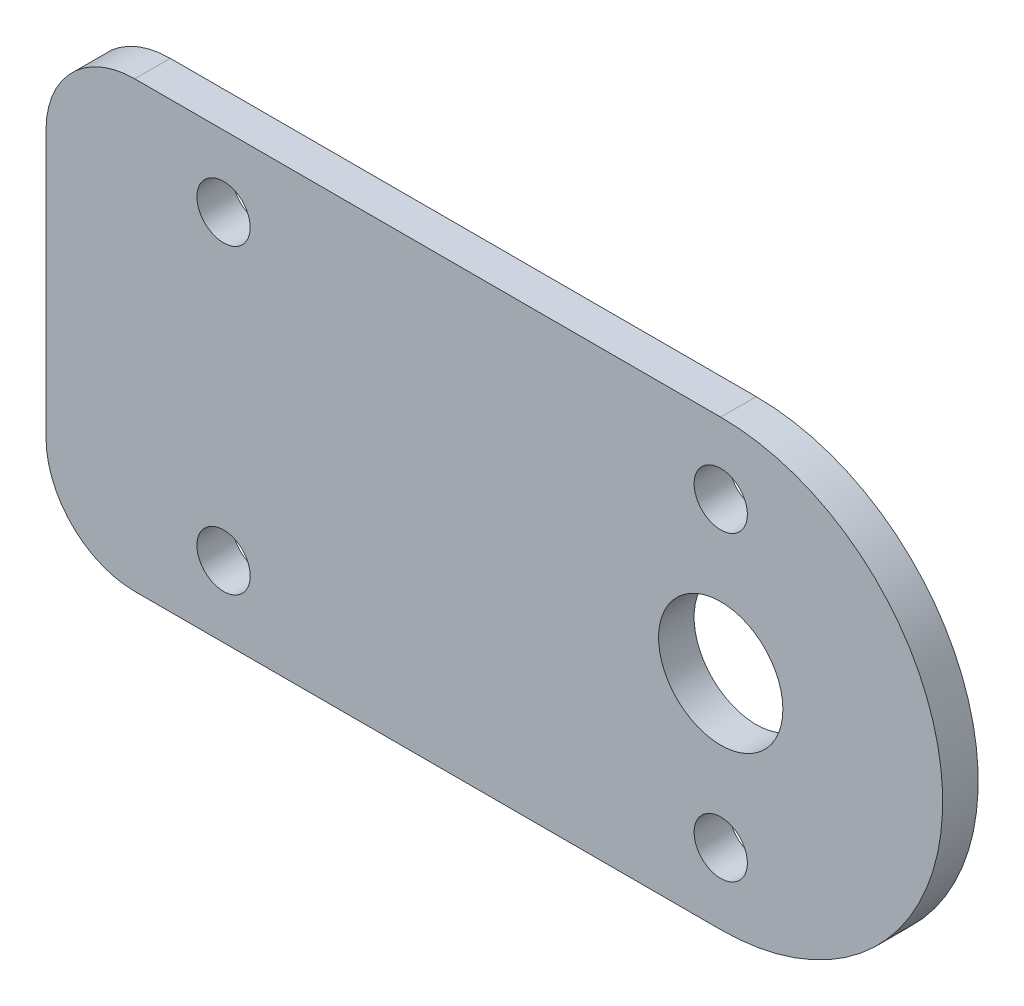
ISO-10303-21;
HEADER;
FILE_DESCRIPTION(('STEP AP214'),'2;1');
FILE_NAME('part.step','',(''),(''),'','','');
FILE_SCHEMA(('AUTOMOTIVE_DESIGN { 1 0 10303 214 1 1 1 1 }'));
ENDSEC;
DATA;
#1=APPLICATION_CONTEXT('core data for automotive mechanical design processes');
#2=APPLICATION_PROTOCOL_DEFINITION('international standard','automotive_design',2000,#1);
#3=PRODUCT_CONTEXT('',#1,'mechanical');
#4=PRODUCT('Part','Part','',(#3));
#5=PRODUCT_RELATED_PRODUCT_CATEGORY('part','',(#4));
#6=PRODUCT_DEFINITION_FORMATION('','',#4);
#7=PRODUCT_DEFINITION_CONTEXT('part definition',#1,'design');
#8=PRODUCT_DEFINITION('design','',#6,#7);
#9=PRODUCT_DEFINITION_SHAPE('','',#8);
#10=(LENGTH_UNIT() NAMED_UNIT(*) SI_UNIT(.MILLI.,.METRE.));
#11=(NAMED_UNIT(*) PLANE_ANGLE_UNIT() SI_UNIT($,.RADIAN.));
#12=(NAMED_UNIT(*) SI_UNIT($,.STERADIAN.) SOLID_ANGLE_UNIT());
#13=UNCERTAINTY_MEASURE_WITH_UNIT(LENGTH_MEASURE(1.E-05),#10,'distance_accuracy_value','');
#14=(GEOMETRIC_REPRESENTATION_CONTEXT(3) GLOBAL_UNCERTAINTY_ASSIGNED_CONTEXT((#13)) GLOBAL_UNIT_ASSIGNED_CONTEXT((#10,
#11,#12)) REPRESENTATION_CONTEXT('',''));
#15=CARTESIAN_POINT('',(0.,0.,0.));
#16=DIRECTION('',(0.,0.,1.));
#17=DIRECTION('',(1.,0.,0.));
#18=AXIS2_PLACEMENT_3D('',#15,#16,#17);
#19=CARTESIAN_POINT('',(21.5,0.,2.));
#20=DIRECTION('',(0.,0.,-1.));
#21=DIRECTION('',(-1.,0.,0.));
#22=AXIS2_PLACEMENT_3D('',#19,#20,#21);
#23=PLANE('',#22);
#24=DIRECTION('',(0.,-1.,0.));
#25=VECTOR('',#24,1.);
#26=CARTESIAN_POINT('',(-16.5,-12.5,2.));
#27=LINE('',#26,#25);
#28=CARTESIAN_POINT('',(-16.5,7.5,2.));
#29=VERTEX_POINT('',#28);
#30=CARTESIAN_POINT('',(-16.5,-7.5,2.));
#31=VERTEX_POINT('',#30);
#32=EDGE_CURVE('E108',#29,#31,#27,.T.);
#33=ORIENTED_EDGE('',*,*,#32,.T.);
#34=CARTESIAN_POINT('',(-11.5,-7.5,2.));
#35=DIRECTION('',(0.,0.,-1.));
#36=DIRECTION('',(-1.,0.,0.));
#37=AXIS2_PLACEMENT_3D('',#34,#35,#36);
#38=CIRCLE('',#37,5.);
#39=CARTESIAN_POINT('',(-11.5,-12.5,2.));
#40=VERTEX_POINT('',#39);
#41=EDGE_CURVE('E51',#31,#40,#38,.F.);
#42=ORIENTED_EDGE('',*,*,#41,.T.);
#43=DIRECTION('',(1.,0.,0.));
#44=VECTOR('',#43,1.);
#45=CARTESIAN_POINT('',(21.5,-12.5,2.));
#46=LINE('',#45,#44);
#47=CARTESIAN_POINT('',(21.5,-12.5,2.));
#48=VERTEX_POINT('',#47);
#49=EDGE_CURVE('E97',#40,#48,#46,.T.);
#50=ORIENTED_EDGE('',*,*,#49,.T.);
#51=CARTESIAN_POINT('',(21.5,0.,2.));
#52=DIRECTION('',(0.,0.,1.));
#53=DIRECTION('',(-1.,0.,0.));
#54=AXIS2_PLACEMENT_3D('',#51,#52,#53);
#55=CIRCLE('',#54,12.5);
#56=CARTESIAN_POINT('',(21.5,12.5,2.));
#57=VERTEX_POINT('',#56);
#58=EDGE_CURVE('E101',#48,#57,#55,.T.);
#59=ORIENTED_EDGE('',*,*,#58,.T.);
#60=DIRECTION('',(-1.,0.,0.));
#61=VECTOR('',#60,1.);
#62=CARTESIAN_POINT('',(21.5,12.5,2.));
#63=LINE('',#62,#61);
#64=CARTESIAN_POINT('',(-11.5,12.5,2.));
#65=VERTEX_POINT('',#64);
#66=EDGE_CURVE('E124',#57,#65,#63,.T.);
#67=ORIENTED_EDGE('',*,*,#66,.T.);
#68=CARTESIAN_POINT('',(-11.5,7.5,2.));
#69=DIRECTION('',(0.,0.,-1.));
#70=DIRECTION('',(-1.,0.,0.));
#71=AXIS2_PLACEMENT_3D('',#68,#69,#70);
#72=CIRCLE('',#71,5.);
#73=EDGE_CURVE('E159',#65,#29,#72,.F.);
#74=ORIENTED_EDGE('',*,*,#73,.T.);
#75=EDGE_LOOP('',(#33,#42,#50,#59,#67,#74));
#76=FACE_BOUND('',#75,.T.);
#77=CARTESIAN_POINT('',(21.5,0.,2.));
#78=DIRECTION('',(0.,0.,1.));
#79=DIRECTION('',(1.,0.,0.));
#80=AXIS2_PLACEMENT_3D('',#77,#78,#79);
#81=CIRCLE('',#80,3.5);
#82=CARTESIAN_POINT('',(25.,0.,2.));
#83=VERTEX_POINT('',#82);
#84=EDGE_CURVE('E135',#83,#83,#81,.T.);
#85=ORIENTED_EDGE('',*,*,#84,.F.);
#86=EDGE_LOOP('',(#85));
#87=FACE_BOUND('',#86,.T.);
#88=CARTESIAN_POINT('',(21.5,8.5,2.));
#89=DIRECTION('',(0.,0.,1.));
#90=DIRECTION('',(1.,0.,0.));
#91=AXIS2_PLACEMENT_3D('',#88,#89,#90);
#92=CIRCLE('',#91,1.5);
#93=CARTESIAN_POINT('',(23.,8.5,2.));
#94=VERTEX_POINT('',#93);
#95=EDGE_CURVE('E168',#94,#94,#92,.T.);
#96=ORIENTED_EDGE('',*,*,#95,.F.);
#97=EDGE_LOOP('',(#96));
#98=FACE_BOUND('',#97,.T.);
#99=CARTESIAN_POINT('',(21.5,-8.5,2.));
#100=DIRECTION('',(0.,0.,1.));
#101=DIRECTION('',(-1.,0.,0.));
#102=AXIS2_PLACEMENT_3D('',#99,#100,#101);
#103=CIRCLE('',#102,1.5);
#104=CARTESIAN_POINT('',(20.,-8.5,2.));
#105=VERTEX_POINT('',#104);
#106=EDGE_CURVE('E180',#105,#105,#103,.T.);
#107=ORIENTED_EDGE('',*,*,#106,.F.);
#108=EDGE_LOOP('',(#107));
#109=FACE_BOUND('',#108,.T.);
#110=CARTESIAN_POINT('',(-6.5,8.5,2.));
#111=DIRECTION('',(0.,0.,1.));
#112=DIRECTION('',(1.,0.,0.));
#113=AXIS2_PLACEMENT_3D('',#110,#111,#112);
#114=CIRCLE('',#113,1.5);
#115=CARTESIAN_POINT('',(-5.,8.5,2.));
#116=VERTEX_POINT('',#115);
#117=EDGE_CURVE('E173',#116,#116,#114,.T.);
#118=ORIENTED_EDGE('',*,*,#117,.F.);
#119=EDGE_LOOP('',(#118));
#120=FACE_BOUND('',#119,.T.);
#121=CARTESIAN_POINT('',(-6.5,-8.5,2.));
#122=DIRECTION('',(0.,0.,1.));
#123=DIRECTION('',(-1.,0.,0.));
#124=AXIS2_PLACEMENT_3D('',#121,#122,#123);
#125=CIRCLE('',#124,1.5);
#126=CARTESIAN_POINT('',(-8.00000000000001,-8.5,2.));
#127=VERTEX_POINT('',#126);
#128=EDGE_CURVE('E174',#127,#127,#125,.T.);
#129=ORIENTED_EDGE('',*,*,#128,.F.);
#130=EDGE_LOOP('',(#129));
#131=FACE_BOUND('',#130,.T.);
#132=ADVANCED_FACE('F42',(#76,#87,#98,#109,#120,#131),#23,.F.);
#133=CARTESIAN_POINT('',(21.5,0.,0.));
#134=DIRECTION('',(0.,0.,-1.));
#135=DIRECTION('',(-1.,0.,0.));
#136=AXIS2_PLACEMENT_3D('',#133,#134,#135);
#137=PLANE('',#136);
#138=CARTESIAN_POINT('',(-6.5,8.5,0.));
#139=DIRECTION('',(0.,0.,1.));
#140=DIRECTION('',(1.,0.,0.));
#141=AXIS2_PLACEMENT_3D('',#138,#139,#140);
#142=CIRCLE('',#141,1.5);
#143=CARTESIAN_POINT('',(-5.,8.5,0.));
#144=VERTEX_POINT('',#143);
#145=EDGE_CURVE('E171',#144,#144,#142,.T.);
#146=ORIENTED_EDGE('',*,*,#145,.T.);
#147=EDGE_LOOP('',(#146));
#148=FACE_BOUND('',#147,.T.);
#149=CARTESIAN_POINT('',(21.5,8.5,0.));
#150=DIRECTION('',(0.,0.,1.));
#151=DIRECTION('',(1.,0.,0.));
#152=AXIS2_PLACEMENT_3D('',#149,#150,#151);
#153=CIRCLE('',#152,1.5);
#154=CARTESIAN_POINT('',(23.,8.5,0.));
#155=VERTEX_POINT('',#154);
#156=EDGE_CURVE('E183',#155,#155,#153,.T.);
#157=ORIENTED_EDGE('',*,*,#156,.T.);
#158=EDGE_LOOP('',(#157));
#159=FACE_BOUND('',#158,.T.);
#160=DIRECTION('',(1.,0.,0.));
#161=VECTOR('',#160,1.);
#162=CARTESIAN_POINT('',(21.5,-12.5,0.));
#163=LINE('',#162,#161);
#164=CARTESIAN_POINT('',(-11.5,-12.5,0.));
#165=VERTEX_POINT('',#164);
#166=CARTESIAN_POINT('',(21.5,-12.5,0.));
#167=VERTEX_POINT('',#166);
#168=EDGE_CURVE('E114',#165,#167,#163,.T.);
#169=ORIENTED_EDGE('',*,*,#168,.F.);
#170=CARTESIAN_POINT('',(-11.5,-7.5,0.));
#171=DIRECTION('',(0.,0.,-1.));
#172=DIRECTION('',(-1.,0.,0.));
#173=AXIS2_PLACEMENT_3D('',#170,#171,#172);
#174=CIRCLE('',#173,5.);
#175=CARTESIAN_POINT('',(-16.5,-7.5,0.));
#176=VERTEX_POINT('',#175);
#177=EDGE_CURVE('E151',#165,#176,#174,.T.);
#178=ORIENTED_EDGE('',*,*,#177,.T.);
#179=DIRECTION('',(0.,-1.,0.));
#180=VECTOR('',#179,1.);
#181=CARTESIAN_POINT('',(-16.5,-12.5,0.));
#182=LINE('',#181,#180);
#183=CARTESIAN_POINT('',(-16.5,7.5,0.));
#184=VERTEX_POINT('',#183);
#185=EDGE_CURVE('E132',#184,#176,#182,.T.);
#186=ORIENTED_EDGE('',*,*,#185,.F.);
#187=CARTESIAN_POINT('',(-11.5,7.5,0.));
#188=DIRECTION('',(0.,0.,-1.));
#189=DIRECTION('',(-1.,0.,0.));
#190=AXIS2_PLACEMENT_3D('',#187,#188,#189);
#191=CIRCLE('',#190,5.);
#192=CARTESIAN_POINT('',(-11.5,12.5,0.));
#193=VERTEX_POINT('',#192);
#194=EDGE_CURVE('E148',#184,#193,#191,.T.);
#195=ORIENTED_EDGE('',*,*,#194,.T.);
#196=DIRECTION('',(-1.,0.,0.));
#197=VECTOR('',#196,1.);
#198=CARTESIAN_POINT('',(21.5,12.5,0.));
#199=LINE('',#198,#197);
#200=CARTESIAN_POINT('',(21.5,12.5,0.));
#201=VERTEX_POINT('',#200);
#202=EDGE_CURVE('E141',#201,#193,#199,.T.);
#203=ORIENTED_EDGE('',*,*,#202,.F.);
#204=CARTESIAN_POINT('',(21.5,0.,0.));
#205=DIRECTION('',(0.,0.,1.));
#206=DIRECTION('',(-1.,0.,0.));
#207=AXIS2_PLACEMENT_3D('',#204,#205,#206);
#208=CIRCLE('',#207,12.5);
#209=EDGE_CURVE('E138',#167,#201,#208,.T.);
#210=ORIENTED_EDGE('',*,*,#209,.F.);
#211=EDGE_LOOP('',(#169,#178,#186,#195,#203,#210));
#212=FACE_BOUND('',#211,.T.);
#213=CARTESIAN_POINT('',(21.5,0.,0.));
#214=DIRECTION('',(0.,0.,1.));
#215=DIRECTION('',(1.,0.,0.));
#216=AXIS2_PLACEMENT_3D('',#213,#214,#215);
#217=CIRCLE('',#216,3.5);
#218=CARTESIAN_POINT('',(25.,0.,0.));
#219=VERTEX_POINT('',#218);
#220=EDGE_CURVE('E164',#219,#219,#217,.T.);
#221=ORIENTED_EDGE('',*,*,#220,.T.);
#222=EDGE_LOOP('',(#221));
#223=FACE_BOUND('',#222,.T.);
#224=CARTESIAN_POINT('',(21.5,-8.5,0.));
#225=DIRECTION('',(0.,0.,1.));
#226=DIRECTION('',(-1.,0.,0.));
#227=AXIS2_PLACEMENT_3D('',#224,#225,#226);
#228=CIRCLE('',#227,1.5);
#229=CARTESIAN_POINT('',(20.,-8.5,0.));
#230=VERTEX_POINT('',#229);
#231=EDGE_CURVE('E177',#230,#230,#228,.T.);
#232=ORIENTED_EDGE('',*,*,#231,.T.);
#233=EDGE_LOOP('',(#232));
#234=FACE_BOUND('',#233,.T.);
#235=CARTESIAN_POINT('',(-6.5,-8.5,0.));
#236=DIRECTION('',(0.,0.,1.));
#237=DIRECTION('',(-1.,0.,0.));
#238=AXIS2_PLACEMENT_3D('',#235,#236,#237);
#239=CIRCLE('',#238,1.5);
#240=CARTESIAN_POINT('',(-8.00000000000001,-8.5,0.));
#241=VERTEX_POINT('',#240);
#242=EDGE_CURVE('E363',#241,#241,#239,.T.);
#243=ORIENTED_EDGE('',*,*,#242,.T.);
#244=EDGE_LOOP('',(#243));
#245=FACE_BOUND('',#244,.T.);
#246=ADVANCED_FACE('F200',(#148,#159,#212,#223,#234,#245),#137,.T.);
#247=CARTESIAN_POINT('',(-16.5,-12.5,2.));
#248=DIRECTION('',(1.,0.,0.));
#249=DIRECTION('',(0.,0.,-1.));
#250=AXIS2_PLACEMENT_3D('',#247,#248,#249);
#251=PLANE('',#250);
#252=ORIENTED_EDGE('',*,*,#185,.T.);
#253=DIRECTION('',(0.,0.,-1.));
#254=VECTOR('',#253,1.);
#255=CARTESIAN_POINT('',(-16.5,-7.5,2.));
#256=LINE('',#255,#254);
#257=EDGE_CURVE('E64',#176,#31,#256,.F.);
#258=ORIENTED_EDGE('',*,*,#257,.T.);
#259=ORIENTED_EDGE('',*,*,#32,.F.);
#260=DIRECTION('',(0.,0.,-1.));
#261=VECTOR('',#260,1.);
#262=CARTESIAN_POINT('',(-16.5,7.5,2.));
#263=LINE('',#262,#261);
#264=EDGE_CURVE('E153',#29,#184,#263,.T.);
#265=ORIENTED_EDGE('',*,*,#264,.T.);
#266=EDGE_LOOP('',(#252,#258,#259,#265));
#267=FACE_BOUND('',#266,.T.);
#268=ADVANCED_FACE('F206',(#267),#251,.F.);
#269=CARTESIAN_POINT('',(21.5,-12.5,2.));
#270=DIRECTION('',(0.,1.,0.));
#271=DIRECTION('',(-1.,0.,0.));
#272=AXIS2_PLACEMENT_3D('',#269,#270,#271);
#273=PLANE('',#272);
#274=ORIENTED_EDGE('',*,*,#49,.F.);
#275=DIRECTION('',(0.,0.,-1.));
#276=VECTOR('',#275,1.);
#277=CARTESIAN_POINT('',(-11.5,-12.5,2.));
#278=LINE('',#277,#276);
#279=EDGE_CURVE('E118',#40,#165,#278,.T.);
#280=ORIENTED_EDGE('',*,*,#279,.T.);
#281=ORIENTED_EDGE('',*,*,#168,.T.);
#282=DIRECTION('',(0.,0.,-1.));
#283=VECTOR('',#282,1.);
#284=CARTESIAN_POINT('',(21.5,-12.5,2.));
#285=LINE('',#284,#283);
#286=EDGE_CURVE('E111',#48,#167,#285,.T.);
#287=ORIENTED_EDGE('',*,*,#286,.F.);
#288=EDGE_LOOP('',(#274,#280,#281,#287));
#289=FACE_BOUND('',#288,.T.);
#290=ADVANCED_FACE('F112',(#289),#273,.F.);
#291=CARTESIAN_POINT('',(21.5,0.,2.));
#292=DIRECTION('',(0.,0.,-1.));
#293=DIRECTION('',(-1.,0.,0.));
#294=AXIS2_PLACEMENT_3D('',#291,#292,#293);
#295=CYLINDRICAL_SURFACE('',#294,12.5);
#296=ORIENTED_EDGE('',*,*,#209,.T.);
#297=DIRECTION('',(0.,0.,-1.));
#298=VECTOR('',#297,1.);
#299=CARTESIAN_POINT('',(21.5,12.5,2.));
#300=LINE('',#299,#298);
#301=EDGE_CURVE('E119',#57,#201,#300,.T.);
#302=ORIENTED_EDGE('',*,*,#301,.F.);
#303=ORIENTED_EDGE('',*,*,#58,.F.);
#304=ORIENTED_EDGE('',*,*,#286,.T.);
#305=EDGE_LOOP('',(#296,#302,#303,#304));
#306=FACE_BOUND('',#305,.T.);
#307=ADVANCED_FACE('F121',(#306),#295,.T.);
#308=CARTESIAN_POINT('',(21.5,12.5,2.));
#309=DIRECTION('',(0.,-1.,0.));
#310=DIRECTION('',(1.,0.,0.));
#311=AXIS2_PLACEMENT_3D('',#308,#309,#310);
#312=PLANE('',#311);
#313=ORIENTED_EDGE('',*,*,#202,.T.);
#314=DIRECTION('',(0.,0.,-1.));
#315=VECTOR('',#314,1.);
#316=CARTESIAN_POINT('',(-11.5,12.5,2.));
#317=LINE('',#316,#315);
#318=EDGE_CURVE('E11',#193,#65,#317,.F.);
#319=ORIENTED_EDGE('',*,*,#318,.T.);
#320=ORIENTED_EDGE('',*,*,#66,.F.);
#321=ORIENTED_EDGE('',*,*,#301,.T.);
#322=EDGE_LOOP('',(#313,#319,#320,#321));
#323=FACE_BOUND('',#322,.T.);
#324=ADVANCED_FACE('F204',(#323),#312,.F.);
#325=CARTESIAN_POINT('',(21.5,0.,2.));
#326=DIRECTION('',(0.,0.,-1.));
#327=DIRECTION('',(-1.,0.,0.));
#328=AXIS2_PLACEMENT_3D('',#325,#326,#327);
#329=CYLINDRICAL_SURFACE('',#328,3.5);
#330=ORIENTED_EDGE('',*,*,#84,.T.);
#331=EDGE_LOOP('',(#330));
#332=FACE_BOUND('',#331,.T.);
#333=ORIENTED_EDGE('',*,*,#220,.F.);
#334=EDGE_LOOP('',(#333));
#335=FACE_BOUND('',#334,.T.);
#336=ADVANCED_FACE('F219',(#332,#335),#329,.F.);
#337=CARTESIAN_POINT('',(21.5,8.5,2.));
#338=DIRECTION('',(0.,0.,-1.));
#339=DIRECTION('',(-1.,0.,0.));
#340=AXIS2_PLACEMENT_3D('',#337,#338,#339);
#341=CYLINDRICAL_SURFACE('',#340,1.5);
#342=ORIENTED_EDGE('',*,*,#95,.T.);
#343=EDGE_LOOP('',(#342));
#344=FACE_BOUND('',#343,.T.);
#345=ORIENTED_EDGE('',*,*,#156,.F.);
#346=EDGE_LOOP('',(#345));
#347=FACE_BOUND('',#346,.T.);
#348=ADVANCED_FACE('F237',(#344,#347),#341,.F.);
#349=CARTESIAN_POINT('',(21.5,-8.5,2.));
#350=DIRECTION('',(0.,0.,-1.));
#351=DIRECTION('',(-1.,0.,0.));
#352=AXIS2_PLACEMENT_3D('',#349,#350,#351);
#353=CYLINDRICAL_SURFACE('',#352,1.5);
#354=ORIENTED_EDGE('',*,*,#106,.T.);
#355=EDGE_LOOP('',(#354));
#356=FACE_BOUND('',#355,.T.);
#357=ORIENTED_EDGE('',*,*,#231,.F.);
#358=EDGE_LOOP('',(#357));
#359=FACE_BOUND('',#358,.T.);
#360=ADVANCED_FACE('F243',(#356,#359),#353,.F.);
#361=CARTESIAN_POINT('',(-6.5,8.5,2.));
#362=DIRECTION('',(0.,0.,-1.));
#363=DIRECTION('',(-1.,0.,0.));
#364=AXIS2_PLACEMENT_3D('',#361,#362,#363);
#365=CYLINDRICAL_SURFACE('',#364,1.5);
#366=ORIENTED_EDGE('',*,*,#117,.T.);
#367=EDGE_LOOP('',(#366));
#368=FACE_BOUND('',#367,.T.);
#369=ORIENTED_EDGE('',*,*,#145,.F.);
#370=EDGE_LOOP('',(#369));
#371=FACE_BOUND('',#370,.T.);
#372=ADVANCED_FACE('F249',(#368,#371),#365,.F.);
#373=CARTESIAN_POINT('',(-6.5,-8.5,2.));
#374=DIRECTION('',(0.,0.,-1.));
#375=DIRECTION('',(-1.,0.,0.));
#376=AXIS2_PLACEMENT_3D('',#373,#374,#375);
#377=CYLINDRICAL_SURFACE('',#376,1.5);
#378=ORIENTED_EDGE('',*,*,#128,.T.);
#379=EDGE_LOOP('',(#378));
#380=FACE_BOUND('',#379,.T.);
#381=ORIENTED_EDGE('',*,*,#242,.F.);
#382=EDGE_LOOP('',(#381));
#383=FACE_BOUND('',#382,.T.);
#384=ADVANCED_FACE('F255',(#380,#383),#377,.F.);
#385=CARTESIAN_POINT('',(-11.5,-7.5,2.));
#386=DIRECTION('',(0.,0.,-1.));
#387=DIRECTION('',(-1.,0.,0.));
#388=AXIS2_PLACEMENT_3D('',#385,#386,#387);
#389=CYLINDRICAL_SURFACE('',#388,5.);
#390=ORIENTED_EDGE('',*,*,#41,.F.);
#391=ORIENTED_EDGE('',*,*,#257,.F.);
#392=ORIENTED_EDGE('',*,*,#177,.F.);
#393=ORIENTED_EDGE('',*,*,#279,.F.);
#394=EDGE_LOOP('',(#390,#391,#392,#393));
#395=FACE_BOUND('',#394,.T.);
#396=ADVANCED_FACE('F198',(#395),#389,.T.);
#397=CARTESIAN_POINT('',(-11.5,7.5,2.));
#398=DIRECTION('',(0.,0.,-1.));
#399=DIRECTION('',(-1.,0.,0.));
#400=AXIS2_PLACEMENT_3D('',#397,#398,#399);
#401=CYLINDRICAL_SURFACE('',#400,5.);
#402=ORIENTED_EDGE('',*,*,#73,.F.);
#403=ORIENTED_EDGE('',*,*,#318,.F.);
#404=ORIENTED_EDGE('',*,*,#194,.F.);
#405=ORIENTED_EDGE('',*,*,#264,.F.);
#406=EDGE_LOOP('',(#402,#403,#404,#405));
#407=FACE_BOUND('',#406,.T.);
#408=ADVANCED_FACE('F44',(#407),#401,.T.);
#409=CLOSED_SHELL('',(#132,#246,#268,#290,#307,#324,#336,#348,#360,#372,#384,#396,#408));
#410=MANIFOLD_SOLID_BREP('B2',#409);
#411=ADVANCED_BREP_SHAPE_REPRESENTATION('',(#18,#410),#14);
#412=SHAPE_DEFINITION_REPRESENTATION(#9,#411);
ENDSEC;
END-ISO-10303-21;
